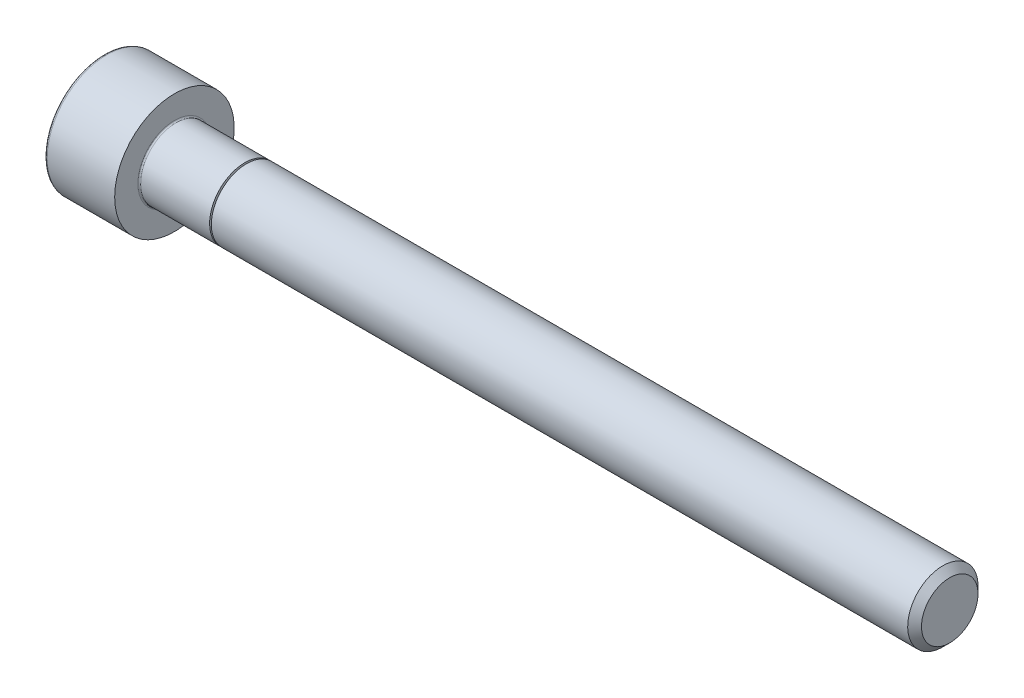
ISO-10303-21;
HEADER;
FILE_DESCRIPTION(('STEP AP214'),'2;1');
FILE_NAME('part.step','',(''),(''),'','','');
FILE_SCHEMA(('AUTOMOTIVE_DESIGN { 1 0 10303 214 1 1 1 1 }'));
ENDSEC;
DATA;
#1=APPLICATION_CONTEXT('core data for automotive mechanical design processes');
#2=APPLICATION_PROTOCOL_DEFINITION('international standard','automotive_design',2000,#1);
#3=PRODUCT_CONTEXT('',#1,'mechanical');
#4=PRODUCT('Part','Part','',(#3));
#5=PRODUCT_RELATED_PRODUCT_CATEGORY('part','',(#4));
#6=PRODUCT_DEFINITION_FORMATION('','',#4);
#7=PRODUCT_DEFINITION_CONTEXT('part definition',#1,'design');
#8=PRODUCT_DEFINITION('design','',#6,#7);
#9=PRODUCT_DEFINITION_SHAPE('','',#8);
#10=(LENGTH_UNIT() NAMED_UNIT(*) SI_UNIT(.MILLI.,.METRE.));
#11=(NAMED_UNIT(*) PLANE_ANGLE_UNIT() SI_UNIT($,.RADIAN.));
#12=(NAMED_UNIT(*) SI_UNIT($,.STERADIAN.) SOLID_ANGLE_UNIT());
#13=UNCERTAINTY_MEASURE_WITH_UNIT(LENGTH_MEASURE(1.E-05),#10,'distance_accuracy_value','');
#14=(GEOMETRIC_REPRESENTATION_CONTEXT(3) GLOBAL_UNCERTAINTY_ASSIGNED_CONTEXT((#13)) GLOBAL_UNIT_ASSIGNED_CONTEXT((#10,
#11,#12)) REPRESENTATION_CONTEXT('',''));
#15=CARTESIAN_POINT('',(0.,0.,0.));
#16=DIRECTION('',(0.,0.,1.));
#17=DIRECTION('',(1.,0.,0.));
#18=AXIS2_PLACEMENT_3D('',#15,#16,#17);
#19=CARTESIAN_POINT('',(0.,0.,2.125));
#20=DIRECTION('',(1.,0.,0.));
#21=DIRECTION('',(0.,1.,0.));
#22=AXIS2_PLACEMENT_3D('',#19,#20,#21);
#23=PLANE('',#22);
#24=CARTESIAN_POINT('',(0.,0.,0.));
#25=DIRECTION('',(1.,0.,0.));
#26=DIRECTION('',(0.,1.,0.));
#27=AXIS2_PLACEMENT_3D('',#24,#25,#26);
#28=CIRCLE('',#27,2.6);
#29=CARTESIAN_POINT('',(0.,2.6,0.));
#30=VERTEX_POINT('',#29);
#31=EDGE_CURVE('E373',#30,#30,#28,.F.);
#32=ORIENTED_EDGE('',*,*,#31,.T.);
#33=EDGE_LOOP('',(#32));
#34=FACE_BOUND('',#33,.T.);
#35=CARTESIAN_POINT('',(0.,0.,0.));
#36=DIRECTION('',(-1.,0.,0.));
#37=DIRECTION('',(0.,0.,1.));
#38=AXIS2_PLACEMENT_3D('',#35,#36,#37);
#39=CIRCLE('',#38,4.25);
#40=CARTESIAN_POINT('',(0.,0.,4.25));
#41=VERTEX_POINT('',#40);
#42=EDGE_CURVE('E136',#41,#41,#39,.F.);
#43=ORIENTED_EDGE('',*,*,#42,.T.);
#44=EDGE_LOOP('',(#43));
#45=FACE_BOUND('',#44,.T.);
#46=ADVANCED_FACE('F44',(#34,#45),#23,.T.);
#47=CARTESIAN_POINT('',(-1.90800000001445,0.,0.));
#48=DIRECTION('',(-1.,0.,0.));
#49=DIRECTION('',(0.,-1.,0.));
#50=AXIS2_PLACEMENT_3D('',#47,#48,#49);
#51=CONICAL_SURFACE('',#50,2.32325748311268,1.04719755117676);
#52=CARTESIAN_POINT('',(-1.90000000006533,2.34860783423843E-11,-2.30940107675049));
#53=CARTESIAN_POINT('',(-1.87069554519307,0.0878878875851641,-2.25865898120469));
#54=CARTESIAN_POINT('',(-1.84404467716676,0.176534422142696,-2.20747888061372));
#55=CARTESIAN_POINT('',(-1.79752638746643,0.355362346707026,-2.10423253022681));
#56=CARTESIAN_POINT('',(-1.77767542040377,0.445546913105644,-2.05216444654021));
#57=CARTESIAN_POINT('',(-1.74677595901153,0.624798433779845,-1.94867353282659));
#58=CARTESIAN_POINT('',(-1.73552178766258,0.713837815637262,-1.89726662174263));
#59=CARTESIAN_POINT('',(-1.72208916819695,0.892335320482581,-1.79421103927044));
#60=CARTESIAN_POINT('',(-1.71989959404131,0.981792795125758,-1.7425627422042));
#61=CARTESIAN_POINT('',(-1.72446629022331,1.14893448972696,-1.64606343983341));
#62=CARTESIAN_POINT('',(-1.73010128528527,1.22664379065794,-1.60119795402236));
#63=CARTESIAN_POINT('',(-1.7479573007879,1.38155614177259,-1.51175926640552));
#64=CARTESIAN_POINT('',(-1.76018441483864,1.45875865655571,-1.46718637371336));
#65=CARTESIAN_POINT('',(-1.79074983340856,1.61399014172298,-1.37756343396534));
#66=CARTESIAN_POINT('',(-1.80921764228855,1.69199947537882,-1.33252472417983));
#67=CARTESIAN_POINT('',(-1.85113176090944,1.84685496999382,-1.24311886267837));
#68=CARTESIAN_POINT('',(-1.87456822882213,1.92370311330048,-1.19875056645355));
#69=CARTESIAN_POINT('',(-1.90000000006969,1.99999999998258,-1.15470053838931));
#70=B_SPLINE_CURVE_WITH_KNOTS('',3,(#52,#53,#54,#55,#56,#57,#58,#59,#60,#61,#62,#63,#64,#65,#66,
#67,#68,#69),.UNSPECIFIED.,.F.,.F.,(4,2,2,2,2,2,2,2,4),(0.,0.31701601155671,0.634793817026958,
0.944707606152337,1.25424088889673,1.52370778262016,1.79342419377203,2.06912162245554,
2.34427797347107),.UNSPECIFIED.);
#71=CARTESIAN_POINT('',(-1.90000000010828,-1.09039597198952E-11,-2.30940107682297));
#72=VERTEX_POINT('',#71);
#73=CARTESIAN_POINT('',(-1.9000000000726,2.,-1.15470053836919));
#74=VERTEX_POINT('',#73);
#75=EDGE_CURVE('E102',#72,#74,#70,.T.);
#76=ORIENTED_EDGE('',*,*,#75,.F.);
#77=CARTESIAN_POINT('',(-1.90000000006969,-1.99999999998258,-1.15470053838931));
#78=CARTESIAN_POINT('',(-1.87069554519536,-1.91211211241947,-1.20544263393238));
#79=CARTESIAN_POINT('',(-1.84404467716809,-1.82346557786117,-1.25662273452234));
#80=CARTESIAN_POINT('',(-1.79752638746686,-1.6446376532959,-1.35986908490872));
#81=CARTESIAN_POINT('',(-1.77767542040425,-1.55445308689711,-1.41193716859581));
#82=CARTESIAN_POINT('',(-1.74677595901191,-1.37520156622245,-1.51542808230998));
#83=CARTESIAN_POINT('',(-1.73552178766281,-1.28616218436474,-1.566834993394));
#84=CARTESIAN_POINT('',(-1.72208916819698,-1.10766467951887,-1.66989057586644));
#85=CARTESIAN_POINT('',(-1.7198995940413,-1.01820720487543,-1.72153887293286));
#86=CARTESIAN_POINT('',(-1.72446629022325,-0.851065510274214,-1.81803817530368));
#87=CARTESIAN_POINT('',(-1.73010128528516,-0.773356209343481,-1.86290366111458));
#88=CARTESIAN_POINT('',(-1.74795730078763,-0.61844385822933,-1.95234234873113));
#89=CARTESIAN_POINT('',(-1.76018441483828,-0.541241343446455,-1.99691524142314));
#90=CARTESIAN_POINT('',(-1.79074983340798,-0.386009858279664,-2.08653818117089));
#91=CARTESIAN_POINT('',(-1.80921764228784,-0.30800052462405,-2.13157689095626));
#92=CARTESIAN_POINT('',(-1.85113176090847,-0.153145030009487,-2.22098275245747));
#93=CARTESIAN_POINT('',(-1.87456822882103,-0.0762968867030372,-2.26535104868217));
#94=CARTESIAN_POINT('',(-1.90000000006845,-2.11462724692866E-11,-2.30940107674629));
#95=B_SPLINE_CURVE_WITH_KNOTS('',3,(#77,#78,#79,#80,#81,#82,#83,#84,#85,#86,#87,#88,#89,#90,#91,
#92,#93,#94),.UNSPECIFIED.,.F.,.F.,(4,2,2,2,2,2,2,2,4),(0.,0.317016011557888,0.634793817029228,
0.944707606155515,1.25424088890086,1.52370778262341,1.79342419377439,2.06912162245705,
2.34427797347178),.UNSPECIFIED.);
#96=CARTESIAN_POINT('',(-1.90000000006969,-1.99999999999129,-1.15470053837422));
#97=VERTEX_POINT('',#96);
#98=EDGE_CURVE('E126',#97,#72,#95,.T.);
#99=ORIENTED_EDGE('',*,*,#98,.F.);
#100=CARTESIAN_POINT('',(-1.90000000004994,-2.00000000003269,1.15470053836484));
#101=CARTESIAN_POINT('',(-1.87069554518889,-2.00000000001174,1.05321634727724));
#102=CARTESIAN_POINT('',(-1.84404467716728,-2.00000000000315,0.950856146097833));
#103=CARTESIAN_POINT('',(-1.79752638747041,-1.99999999999685,0.744363445327653));
#104=CARTESIAN_POINT('',(-1.77767542040649,-1.99999999999916,0.640227277955542));
#105=CARTESIAN_POINT('',(-1.746775959013,-2.00000000000081,0.433245450530546));
#106=CARTESIAN_POINT('',(-1.73552178766403,-2.00000000000022,0.330431628363774));
#107=CARTESIAN_POINT('',(-1.72208916819776,-1.99999999999978,0.124320463421629));
#108=CARTESIAN_POINT('',(-1.71989959404148,-1.99999999999995,0.0210238692902604));
#109=CARTESIAN_POINT('',(-1.7244662902223,-2.00000000000005,-0.171974735452019));
#110=CARTESIAN_POINT('',(-1.73010128528393,-2.00000000000001,-0.261705707075888));
#111=CARTESIAN_POINT('',(-1.74795730078618,-1.99999999999999,-0.440583082313188));
#112=CARTESIAN_POINT('',(-1.76018441483687,-2.,-0.529728867699324));
#113=CARTESIAN_POINT('',(-1.79074983340694,-2.,-0.708974747198913));
#114=CARTESIAN_POINT('',(-1.80921764228713,-2.,-0.799052166771626));
#115=CARTESIAN_POINT('',(-1.8511317609086,-2.,-0.97786388977785));
#116=CARTESIAN_POINT('',(-1.87456822882168,-2.,-1.06660048222909));
#117=CARTESIAN_POINT('',(-1.90000000006969,-2.,-1.15470053835913));
#118=B_SPLINE_CURVE_WITH_KNOTS('',3,(#100,#101,#102,#103,#104,#105,#106,#107,#108,#109,#110,
#111,#112,#113,#114,#115,#116,#117),.UNSPECIFIED.,.F.,.F.,(4,2,2,2,2,2,2,2,4),(0.,
0.317016011552173,0.634793817018436,0.944707606140734,1.25424088888182,1.5237077826105,
1.79342419376778,2.06912162245642,2.34427797347685),.UNSPECIFIED.);
#119=CARTESIAN_POINT('',(-1.90000000006969,-1.99999999999129,1.15470053837422));
#120=VERTEX_POINT('',#119);
#121=EDGE_CURVE('E169',#120,#97,#118,.T.);
#122=ORIENTED_EDGE('',*,*,#121,.F.);
#123=CARTESIAN_POINT('',(-1.90000000006533,-2.34854365718914E-11,2.30940107675049));
#124=CARTESIAN_POINT('',(-1.87069554519307,-0.087887887585164,2.25865898120469));
#125=CARTESIAN_POINT('',(-1.84404467716676,-0.176534422142696,2.20747888061372));
#126=CARTESIAN_POINT('',(-1.79752638746643,-0.355362346707026,2.10423253022681));
#127=CARTESIAN_POINT('',(-1.77767542040377,-0.445546913105644,2.05216444654021));
#128=CARTESIAN_POINT('',(-1.74677595901153,-0.624798433779845,1.94867353282659));
#129=CARTESIAN_POINT('',(-1.73552178766258,-0.713837815637262,1.89726662174263));
#130=CARTESIAN_POINT('',(-1.72208916819695,-0.892335320482581,1.79421103927044));
#131=CARTESIAN_POINT('',(-1.71989959404131,-0.981792795125758,1.7425627422042));
#132=CARTESIAN_POINT('',(-1.72446629022331,-1.14893448972696,1.64606343983341));
#133=CARTESIAN_POINT('',(-1.73010128528527,-1.22664379065794,1.60119795402236));
#134=CARTESIAN_POINT('',(-1.7479573007879,-1.38155614177259,1.51175926640552));
#135=CARTESIAN_POINT('',(-1.76018441483864,-1.45875865655571,1.46718637371336));
#136=CARTESIAN_POINT('',(-1.79074983340856,-1.61399014172298,1.37756343396534));
#137=CARTESIAN_POINT('',(-1.80921764228855,-1.69199947537882,1.33252472417983));
#138=CARTESIAN_POINT('',(-1.85113176090944,-1.84685496999382,1.24311886267837));
#139=CARTESIAN_POINT('',(-1.87456822882213,-1.92370311330048,1.19875056645355));
#140=CARTESIAN_POINT('',(-1.90000000006969,-1.99999999998258,1.15470053838931));
#141=B_SPLINE_CURVE_WITH_KNOTS('',3,(#123,#124,#125,#126,#127,#128,#129,#130,#131,#132,#133,
#134,#135,#136,#137,#138,#139,#140),.UNSPECIFIED.,.F.,.F.,(4,2,2,2,2,2,2,2,4),(0.,
0.31701601155671,0.634793817026958,0.944707606152336,1.25424088889673,1.52370778262016,
1.79342419377203,2.06912162245554,2.34427797347107),.UNSPECIFIED.);
#142=CARTESIAN_POINT('',(-1.90000000007986,1.09045409875299E-11,2.30940107676613));
#143=VERTEX_POINT('',#142);
#144=EDGE_CURVE('E164',#143,#120,#141,.T.);
#145=ORIENTED_EDGE('',*,*,#144,.F.);
#146=CARTESIAN_POINT('',(-1.90000000004994,2.00000000000386,1.15470053841477));
#147=CARTESIAN_POINT('',(-1.87069554518889,1.91211211242902,1.20544263394042));
#148=CARTESIAN_POINT('',(-1.84404467716728,1.82346557786687,1.25662273452269));
#149=CARTESIAN_POINT('',(-1.79752638747041,1.64463765330068,1.35986908490232));
#150=CARTESIAN_POINT('',(-1.77767542040649,1.55445308690485,1.41193716859038));
#151=CARTESIAN_POINT('',(-1.746775959013,1.3752015662339,1.51542808230431));
#152=CARTESIAN_POINT('',(-1.73552178766404,1.286162184377,1.56683499338718));
#153=CARTESIAN_POINT('',(-1.72208916819776,1.10766467953328,1.66989057585787));
#154=CARTESIAN_POINT('',(-1.71989959404148,1.01820720489118,1.7215388729237));
#155=CARTESIAN_POINT('',(-1.72446629022229,0.851065510289782,1.81803817529475));
#156=CARTESIAN_POINT('',(-1.73010128528389,0.773356209357547,1.86290366110647));
#157=CARTESIAN_POINT('',(-1.74795730078601,0.618443858240374,1.95234234872474));
#158=CARTESIAN_POINT('',(-1.76018441483661,0.541241343455978,1.99691524141764));
#159=CARTESIAN_POINT('',(-1.79074983340646,0.386009858286279,2.08653818116708));
#160=CARTESIAN_POINT('',(-1.80921764228651,0.308000524629274,2.13157689095325));
#161=CARTESIAN_POINT('',(-1.8511317609077,0.153145030012036,2.220982752456));
#162=CARTESIAN_POINT('',(-1.8745682288206,0.0762968867043,2.26535104868144));
#163=CARTESIAN_POINT('',(-1.90000000006845,2.11474228845271E-11,2.30940107674629));
#164=B_SPLINE_CURVE_WITH_KNOTS('',3,(#146,#147,#148,#149,#150,#151,#152,#153,#154,#155,#156,
#157,#158,#159,#160,#161,#162,#163),.UNSPECIFIED.,.F.,.F.,(4,2,2,2,2,2,2,2,4),(0.,
0.317016011552169,0.634793817018427,0.944707606140729,1.25424088888182,1.52370778260941,
1.7934241937656,2.06912162245308,2.34427797347237),.UNSPECIFIED.);
#165=CARTESIAN_POINT('',(-1.90000000006969,1.99999999999129,1.15470053837422));
#166=VERTEX_POINT('',#165);
#167=EDGE_CURVE('E104',#166,#143,#164,.T.);
#168=ORIENTED_EDGE('',*,*,#167,.F.);
#169=CARTESIAN_POINT('',(-1.90000000006969,2.,-1.15470053835913));
#170=CARTESIAN_POINT('',(-1.87069554519536,2.,-1.053216347273));
#171=CARTESIAN_POINT('',(-1.84404467716809,2.,-0.95085614609307));
#172=CARTESIAN_POINT('',(-1.79752638746686,2.,-0.744363445320298));
#173=CARTESIAN_POINT('',(-1.77767542040425,2.,-0.640227277946112));
#174=CARTESIAN_POINT('',(-1.74677595901191,2.,-0.433245450517777));
#175=CARTESIAN_POINT('',(-1.73552178766281,2.,-0.330431628349734));
#176=CARTESIAN_POINT('',(-1.72208916819698,2.,-0.124320463404862));
#177=CARTESIAN_POINT('',(-1.7198995940413,2.,-0.0210238692720362));
#178=CARTESIAN_POINT('',(-1.72446629022327,2.,0.171974735470407));
#179=CARTESIAN_POINT('',(-1.73010128528526,2.,0.261705707093001));
#180=CARTESIAN_POINT('',(-1.74795730078801,2.,0.440583082327695));
#181=CARTESIAN_POINT('',(-1.76018441483885,2.,0.529728867712501));
#182=CARTESIAN_POINT('',(-1.79074983340904,2.,0.708974747209597));
#183=CARTESIAN_POINT('',(-1.80921764228919,2.,0.799052166781147));
#184=CARTESIAN_POINT('',(-1.85113176091048,2.,0.977863889785148));
#185=CARTESIAN_POINT('',(-1.87456822882339,2.,1.06660048223533));
#186=CARTESIAN_POINT('',(-1.90000000007119,2.,1.15470053836433));
#187=B_SPLINE_CURVE_WITH_KNOTS('',3,(#169,#170,#171,#172,#173,#174,#175,#176,#177,#178,#179,
#180,#181,#182,#183,#184,#185,#186),.UNSPECIFIED.,.F.,.F.,(4,2,2,2,2,2,2,2,4),(0.,
0.317016011557898,0.634793817029249,0.944707606155526,1.25424088890086,1.52370778262581,
1.79342419377921,2.06912162246442,2.34427797348166),.UNSPECIFIED.);
#188=EDGE_CURVE('E97',#74,#166,#187,.T.);
#189=ORIENTED_EDGE('',*,*,#188,.F.);
#190=EDGE_LOOP('',(#76,#99,#122,#145,#168,#189));
#191=FACE_BOUND('',#190,.T.);
#192=CARTESIAN_POINT('',(-0.566666666742321,0.,-5.6843418860808E-11));
#193=VERTEX_POINT('',#192);
#194=VERTEX_LOOP('',#193);
#195=FACE_BOUND('',#194,.T.);
#196=ADVANCED_FACE('F99',(#191,#195),#51,.F.);
#197=CARTESIAN_POINT('',(0.,2.,1.15470053837925));
#198=DIRECTION('',(0.,-1.,0.));
#199=DIRECTION('',(1.,0.,0.));
#200=AXIS2_PLACEMENT_3D('',#197,#198,#199);
#201=PLANE('',#200);
#202=DIRECTION('',(0.,0.,1.));
#203=VECTOR('',#202,1.);
#204=CARTESIAN_POINT('',(-4.99999999995,2.,2.025));
#205=LINE('',#204,#203);
#206=CARTESIAN_POINT('',(-4.999999999975,2.,-1.15470053837925));
#207=VERTEX_POINT('',#206);
#208=CARTESIAN_POINT('',(-4.99999999996667,2.,1.15470053837925));
#209=VERTEX_POINT('',#208);
#210=EDGE_CURVE('E114',#207,#209,#205,.T.);
#211=ORIENTED_EDGE('',*,*,#210,.F.);
#212=DIRECTION('',(1.,0.,0.));
#213=VECTOR('',#212,1.);
#214=CARTESIAN_POINT('',(0.,2.,-1.15470053837925));
#215=LINE('',#214,#213);
#216=EDGE_CURVE('E111',#74,#207,#215,.F.);
#217=ORIENTED_EDGE('',*,*,#216,.F.);
#218=ORIENTED_EDGE('',*,*,#188,.T.);
#219=DIRECTION('',(1.,0.,0.));
#220=VECTOR('',#219,1.);
#221=CARTESIAN_POINT('',(0.,2.,1.15470053837925));
#222=LINE('',#221,#220);
#223=EDGE_CURVE('E299',#209,#166,#222,.T.);
#224=ORIENTED_EDGE('',*,*,#223,.F.);
#225=EDGE_LOOP('',(#211,#217,#218,#224));
#226=FACE_BOUND('',#225,.T.);
#227=ADVANCED_FACE('F112',(#226),#201,.T.);
#228=CARTESIAN_POINT('',(0.,0.,2.3094010767585));
#229=DIRECTION('',(0.,-0.5,-0.866025403784439));
#230=DIRECTION('',(0.,0.866025403784439,-0.5));
#231=AXIS2_PLACEMENT_3D('',#228,#229,#230);
#232=PLANE('',#231);
#233=DIRECTION('',(0.,-0.866025403784438,0.500000000000001));
#234=VECTOR('',#233,1.);
#235=CARTESIAN_POINT('',(-4.99999999995,2.,1.15470053837925));
#236=LINE('',#235,#234);
#237=CARTESIAN_POINT('',(-4.999999999975,0.,2.3094010767585));
#238=VERTEX_POINT('',#237);
#239=EDGE_CURVE('E257',#209,#238,#236,.T.);
#240=ORIENTED_EDGE('',*,*,#239,.F.);
#241=ORIENTED_EDGE('',*,*,#223,.T.);
#242=ORIENTED_EDGE('',*,*,#167,.T.);
#243=DIRECTION('',(1.,0.,0.));
#244=VECTOR('',#243,1.);
#245=CARTESIAN_POINT('',(0.,0.,2.3094010767585));
#246=LINE('',#245,#244);
#247=EDGE_CURVE('E177',#238,#143,#246,.T.);
#248=ORIENTED_EDGE('',*,*,#247,.F.);
#249=EDGE_LOOP('',(#240,#241,#242,#248));
#250=FACE_BOUND('',#249,.T.);
#251=ADVANCED_FACE('F187',(#250),#232,.T.);
#252=CARTESIAN_POINT('',(0.,-2.,1.15470053837925));
#253=DIRECTION('',(0.,0.5,-0.866025403784438));
#254=DIRECTION('',(0.,0.866025403784438,0.5));
#255=AXIS2_PLACEMENT_3D('',#252,#253,#254);
#256=PLANE('',#255);
#257=DIRECTION('',(0.,-0.866025403784439,-0.5));
#258=VECTOR('',#257,1.);
#259=CARTESIAN_POINT('',(-4.99999999995,0.,2.3094010767585));
#260=LINE('',#259,#258);
#261=CARTESIAN_POINT('',(-4.999999999975,-2.,1.15470053837925));
#262=VERTEX_POINT('',#261);
#263=EDGE_CURVE('E264',#238,#262,#260,.T.);
#264=ORIENTED_EDGE('',*,*,#263,.F.);
#265=ORIENTED_EDGE('',*,*,#247,.T.);
#266=ORIENTED_EDGE('',*,*,#144,.T.);
#267=DIRECTION('',(1.,0.,0.));
#268=VECTOR('',#267,1.);
#269=CARTESIAN_POINT('',(0.,-2.,1.15470053837925));
#270=LINE('',#269,#268);
#271=EDGE_CURVE('E176',#262,#120,#270,.T.);
#272=ORIENTED_EDGE('',*,*,#271,.F.);
#273=EDGE_LOOP('',(#264,#265,#266,#272));
#274=FACE_BOUND('',#273,.T.);
#275=ADVANCED_FACE('F182',(#274),#256,.T.);
#276=CARTESIAN_POINT('',(0.,-2.,-1.15470053837925));
#277=DIRECTION('',(0.,1.,0.));
#278=DIRECTION('',(0.,0.,1.));
#279=AXIS2_PLACEMENT_3D('',#276,#277,#278);
#280=PLANE('',#279);
#281=DIRECTION('',(0.,0.,1.));
#282=VECTOR('',#281,1.);
#283=CARTESIAN_POINT('',(-4.99999999995,-2.,2.025));
#284=LINE('',#283,#282);
#285=CARTESIAN_POINT('',(-4.999999999975,-2.,-1.15470053837925));
#286=VERTEX_POINT('',#285);
#287=EDGE_CURVE('E236',#262,#286,#284,.F.);
#288=ORIENTED_EDGE('',*,*,#287,.F.);
#289=ORIENTED_EDGE('',*,*,#271,.T.);
#290=ORIENTED_EDGE('',*,*,#121,.T.);
#291=DIRECTION('',(1.,0.,0.));
#292=VECTOR('',#291,1.);
#293=CARTESIAN_POINT('',(0.,-2.,-1.15470053837925));
#294=LINE('',#293,#292);
#295=EDGE_CURVE('E121',#286,#97,#294,.T.);
#296=ORIENTED_EDGE('',*,*,#295,.F.);
#297=EDGE_LOOP('',(#288,#289,#290,#296));
#298=FACE_BOUND('',#297,.T.);
#299=ADVANCED_FACE('F178',(#298),#280,.T.);
#300=CARTESIAN_POINT('',(0.,0.,-2.3094010767585));
#301=DIRECTION('',(0.,0.5,0.866025403784439));
#302=DIRECTION('',(0.,-0.866025403784439,0.5));
#303=AXIS2_PLACEMENT_3D('',#300,#301,#302);
#304=PLANE('',#303);
#305=DIRECTION('',(0.,0.866025403784438,-0.5));
#306=VECTOR('',#305,1.);
#307=CARTESIAN_POINT('',(-4.99999999995,-2.,-1.15470053837925));
#308=LINE('',#307,#306);
#309=CARTESIAN_POINT('',(-5.,0.,-2.3094010767585));
#310=VERTEX_POINT('',#309);
#311=EDGE_CURVE('E230',#286,#310,#308,.T.);
#312=ORIENTED_EDGE('',*,*,#311,.F.);
#313=ORIENTED_EDGE('',*,*,#295,.T.);
#314=ORIENTED_EDGE('',*,*,#98,.T.);
#315=DIRECTION('',(1.,0.,0.));
#316=VECTOR('',#315,1.);
#317=CARTESIAN_POINT('',(0.,0.,-2.3094010767585));
#318=LINE('',#317,#316);
#319=EDGE_CURVE('E61',#310,#72,#318,.T.);
#320=ORIENTED_EDGE('',*,*,#319,.F.);
#321=EDGE_LOOP('',(#312,#313,#314,#320));
#322=FACE_BOUND('',#321,.T.);
#323=ADVANCED_FACE('F181',(#322),#304,.T.);
#324=CARTESIAN_POINT('',(0.,2.,-1.15470053837925));
#325=DIRECTION('',(0.,-0.500000000000001,0.866025403784438));
#326=DIRECTION('',(0.,-0.866025403784438,-0.500000000000001));
#327=AXIS2_PLACEMENT_3D('',#324,#325,#326);
#328=PLANE('',#327);
#329=DIRECTION('',(0.,0.866025403784439,0.5));
#330=VECTOR('',#329,1.);
#331=CARTESIAN_POINT('',(-4.99999999995,0.,-2.3094010767585));
#332=LINE('',#331,#330);
#333=EDGE_CURVE('E223',#310,#207,#332,.T.);
#334=ORIENTED_EDGE('',*,*,#333,.F.);
#335=ORIENTED_EDGE('',*,*,#319,.T.);
#336=ORIENTED_EDGE('',*,*,#75,.T.);
#337=ORIENTED_EDGE('',*,*,#216,.T.);
#338=EDGE_LOOP('',(#334,#335,#336,#337));
#339=FACE_BOUND('',#338,.T.);
#340=ADVANCED_FACE('F119',(#339),#328,.T.);
#341=CARTESIAN_POINT('',(-4.99999999995,0.,2.025));
#342=DIRECTION('',(-1.,0.,0.));
#343=DIRECTION('',(0.,0.,1.));
#344=AXIS2_PLACEMENT_3D('',#341,#342,#343);
#345=PLANE('',#344);
#346=CARTESIAN_POINT('',(-4.99999999995,0.,0.));
#347=DIRECTION('',(-1.,0.,0.));
#348=DIRECTION('',(0.,0.,1.));
#349=AXIS2_PLACEMENT_3D('',#346,#347,#348);
#350=CIRCLE('',#349,4.05);
#351=CARTESIAN_POINT('',(-4.99999999995,0.,4.05));
#352=VERTEX_POINT('',#351);
#353=EDGE_CURVE('E13',#352,#352,#350,.T.);
#354=ORIENTED_EDGE('',*,*,#353,.T.);
#355=EDGE_LOOP('',(#354));
#356=FACE_BOUND('',#355,.T.);
#357=ORIENTED_EDGE('',*,*,#311,.T.);
#358=ORIENTED_EDGE('',*,*,#333,.T.);
#359=ORIENTED_EDGE('',*,*,#210,.T.);
#360=ORIENTED_EDGE('',*,*,#239,.T.);
#361=ORIENTED_EDGE('',*,*,#263,.T.);
#362=ORIENTED_EDGE('',*,*,#287,.T.);
#363=EDGE_LOOP('',(#357,#358,#359,#360,#361,#362));
#364=FACE_BOUND('',#363,.T.);
#365=ADVANCED_FACE('F207',(#356,#364),#345,.T.);
#366=CARTESIAN_POINT('',(-2.4,0.,0.));
#367=DIRECTION('',(-1.,0.,0.));
#368=DIRECTION('',(0.,0.,1.));
#369=AXIS2_PLACEMENT_3D('',#366,#367,#368);
#370=CYLINDRICAL_SURFACE('',#369,4.25);
#371=CARTESIAN_POINT('',(-4.79999999995,0.,0.));
#372=DIRECTION('',(-1.,0.,0.));
#373=DIRECTION('',(0.,0.,1.));
#374=AXIS2_PLACEMENT_3D('',#371,#372,#373);
#375=CIRCLE('',#374,4.25);
#376=CARTESIAN_POINT('',(-4.79999999995,0.,4.25));
#377=VERTEX_POINT('',#376);
#378=EDGE_CURVE('E53',#377,#377,#375,.F.);
#379=ORIENTED_EDGE('',*,*,#378,.T.);
#380=EDGE_LOOP('',(#379));
#381=FACE_BOUND('',#380,.T.);
#382=ORIENTED_EDGE('',*,*,#42,.F.);
#383=EDGE_LOOP('',(#382));
#384=FACE_BOUND('',#383,.T.);
#385=ADVANCED_FACE('F199',(#381,#384),#370,.T.);
#386=CARTESIAN_POINT('',(5.,0.,0.));
#387=DIRECTION('',(-1.,0.,0.));
#388=DIRECTION('',(0.,-1.,0.));
#389=AXIS2_PLACEMENT_3D('',#386,#387,#388);
#390=CYLINDRICAL_SURFACE('',#389,2.5);
#391=CARTESIAN_POINT('',(0.0999999999999994,0.,0.));
#392=DIRECTION('',(1.,0.,0.));
#393=DIRECTION('',(0.,1.,0.));
#394=AXIS2_PLACEMENT_3D('',#391,#392,#393);
#395=CIRCLE('',#394,2.5);
#396=CARTESIAN_POINT('',(0.0999999999999994,2.5,0.));
#397=VERTEX_POINT('',#396);
#398=EDGE_CURVE('E374',#397,#397,#395,.T.);
#399=ORIENTED_EDGE('',*,*,#398,.T.);
#400=EDGE_LOOP('',(#399));
#401=FACE_BOUND('',#400,.T.);
#402=CARTESIAN_POINT('',(5.,0.,0.));
#403=DIRECTION('',(1.,0.,0.));
#404=DIRECTION('',(0.,1.,0.));
#405=AXIS2_PLACEMENT_3D('',#402,#403,#404);
#406=CIRCLE('',#405,2.5);
#407=CARTESIAN_POINT('',(5.,2.5,0.));
#408=VERTEX_POINT('',#407);
#409=EDGE_CURVE('E108',#408,#408,#406,.T.);
#410=ORIENTED_EDGE('',*,*,#409,.F.);
#411=EDGE_LOOP('',(#410));
#412=FACE_BOUND('',#411,.T.);
#413=ADVANCED_FACE('F150',(#401,#412),#390,.T.);
#414=CARTESIAN_POINT('',(5.,0.,0.));
#415=DIRECTION('',(-1.,0.,0.));
#416=DIRECTION('',(0.,1.,0.));
#417=AXIS2_PLACEMENT_3D('',#414,#415,#416);
#418=CONICAL_SURFACE('',#417,2.49999999999773,1.44644133224813);
#419=CARTESIAN_POINT('',(5.06131250000152,0.,0.));
#420=DIRECTION('',(1.,0.,0.));
#421=DIRECTION('',(0.,1.,0.));
#422=AXIS2_PLACEMENT_3D('',#419,#420,#421);
#423=CIRCLE('',#422,2.00949999998558);
#424=CARTESIAN_POINT('',(5.06131250000152,2.00949999998558,0.));
#425=VERTEX_POINT('',#424);
#426=EDGE_CURVE('E408',#425,#425,#423,.T.);
#427=ORIENTED_EDGE('',*,*,#426,.F.);
#428=EDGE_LOOP('',(#427));
#429=FACE_BOUND('',#428,.T.);
#430=ORIENTED_EDGE('',*,*,#409,.T.);
#431=EDGE_LOOP('',(#430));
#432=FACE_BOUND('',#431,.T.);
#433=ADVANCED_FACE('F213',(#429,#432),#418,.T.);
#434=CARTESIAN_POINT('',(5.06131250000152,0.,0.));
#435=DIRECTION('',(1.,0.,0.));
#436=DIRECTION('',(0.,1.,0.));
#437=AXIS2_PLACEMENT_3D('',#434,#435,#436);
#438=CONICAL_SURFACE('',#437,2.00949999998556,1.44644133224814);
#439=CARTESIAN_POINT('',(5.12262500000374,0.,0.));
#440=DIRECTION('',(1.,0.,0.));
#441=DIRECTION('',(0.,1.,0.));
#442=AXIS2_PLACEMENT_3D('',#439,#440,#441);
#443=CIRCLE('',#442,2.5000000000033);
#444=CARTESIAN_POINT('',(5.12262500000374,2.5000000000033,0.));
#445=VERTEX_POINT('',#444);
#446=EDGE_CURVE('E413',#445,#445,#443,.T.);
#447=ORIENTED_EDGE('',*,*,#446,.F.);
#448=EDGE_LOOP('',(#447));
#449=FACE_BOUND('',#448,.T.);
#450=ORIENTED_EDGE('',*,*,#426,.T.);
#451=EDGE_LOOP('',(#450));
#452=FACE_BOUND('',#451,.T.);
#453=ADVANCED_FACE('F396',(#449,#452),#438,.T.);
#454=CARTESIAN_POINT('',(55.1226250000037,0.,0.));
#455=DIRECTION('',(-1.,0.,0.));
#456=DIRECTION('',(0.,-1.,0.));
#457=AXIS2_PLACEMENT_3D('',#454,#455,#456);
#458=CYLINDRICAL_SURFACE('',#457,2.5);
#459=CARTESIAN_POINT('',(54.6321250000625,0.,0.));
#460=DIRECTION('',(1.,0.,0.));
#461=DIRECTION('',(0.,1.,0.));
#462=AXIS2_PLACEMENT_3D('',#459,#460,#461);
#463=CIRCLE('',#462,2.5);
#464=CARTESIAN_POINT('',(54.6321250000625,2.5,0.));
#465=VERTEX_POINT('',#464);
#466=EDGE_CURVE('E228',#465,#465,#463,.F.);
#467=ORIENTED_EDGE('',*,*,#466,.T.);
#468=EDGE_LOOP('',(#467));
#469=FACE_BOUND('',#468,.T.);
#470=ORIENTED_EDGE('',*,*,#446,.T.);
#471=EDGE_LOOP('',(#470));
#472=FACE_BOUND('',#471,.T.);
#473=ADVANCED_FACE('F385',(#469,#472),#458,.T.);
#474=CARTESIAN_POINT('',(55.1226250000037,0.,0.));
#475=DIRECTION('',(1.,0.,0.));
#476=DIRECTION('',(0.,1.,0.));
#477=AXIS2_PLACEMENT_3D('',#474,#475,#476);
#478=PLANE('',#477);
#479=CARTESIAN_POINT('',(55.1226250000037,0.,0.));
#480=DIRECTION('',(1.,0.,0.));
#481=DIRECTION('',(0.,1.,0.));
#482=AXIS2_PLACEMENT_3D('',#479,#480,#481);
#483=CIRCLE('',#482,2.00950000005874);
#484=CARTESIAN_POINT('',(55.1226250000037,2.00950000005874,0.));
#485=VERTEX_POINT('',#484);
#486=EDGE_CURVE('E222',#485,#485,#483,.T.);
#487=ORIENTED_EDGE('',*,*,#486,.T.);
#488=EDGE_LOOP('',(#487));
#489=FACE_BOUND('',#488,.T.);
#490=ADVANCED_FACE('F389',(#489),#478,.T.);
#491=CARTESIAN_POINT('',(55.1226250000037,0.,0.));
#492=DIRECTION('',(-1.,0.,0.));
#493=DIRECTION('',(0.,-1.,0.));
#494=AXIS2_PLACEMENT_3D('',#491,#492,#493);
#495=CONICAL_SURFACE('',#494,2.00950000005874,0.785398163397446);
#496=ORIENTED_EDGE('',*,*,#466,.F.);
#497=EDGE_LOOP('',(#496));
#498=FACE_BOUND('',#497,.T.);
#499=ORIENTED_EDGE('',*,*,#486,.F.);
#500=EDGE_LOOP('',(#499));
#501=FACE_BOUND('',#500,.T.);
#502=ADVANCED_FACE('F153',(#498,#501),#495,.T.);
#503=CARTESIAN_POINT('',(0.0999999999999994,0.,0.));
#504=DIRECTION('',(1.,0.,0.));
#505=DIRECTION('',(0.,1.,0.));
#506=AXIS2_PLACEMENT_3D('',#503,#504,#505);
#507=TOROIDAL_SURFACE('',#506,2.6,0.1);
#508=ORIENTED_EDGE('',*,*,#31,.F.);
#509=EDGE_LOOP('',(#508));
#510=FACE_BOUND('',#509,.T.);
#511=ORIENTED_EDGE('',*,*,#398,.F.);
#512=EDGE_LOOP('',(#511));
#513=FACE_BOUND('',#512,.T.);
#514=ADVANCED_FACE('F342',(#510,#513),#507,.F.);
#515=CARTESIAN_POINT('',(-4.79999999995,0.,0.));
#516=DIRECTION('',(-1.,0.,0.));
#517=DIRECTION('',(0.,0.,1.));
#518=AXIS2_PLACEMENT_3D('',#515,#516,#517);
#519=TOROIDAL_SURFACE('',#518,4.05,0.200000000000002);
#520=ORIENTED_EDGE('',*,*,#353,.F.);
#521=EDGE_LOOP('',(#520));
#522=FACE_BOUND('',#521,.T.);
#523=ORIENTED_EDGE('',*,*,#378,.F.);
#524=EDGE_LOOP('',(#523));
#525=FACE_BOUND('',#524,.T.);
#526=ADVANCED_FACE('F46',(#522,#525),#519,.T.);
#527=CLOSED_SHELL('',(#46,#196,#227,#251,#275,#299,#323,#340,#365,#385,#413,#433,#453,#473,#490,
#502,#514,#526));
#528=MANIFOLD_SOLID_BREP('B2',#527);
#529=ADVANCED_BREP_SHAPE_REPRESENTATION('',(#18,#528),#14);
#530=SHAPE_DEFINITION_REPRESENTATION(#9,#529);
ENDSEC;
END-ISO-10303-21;
